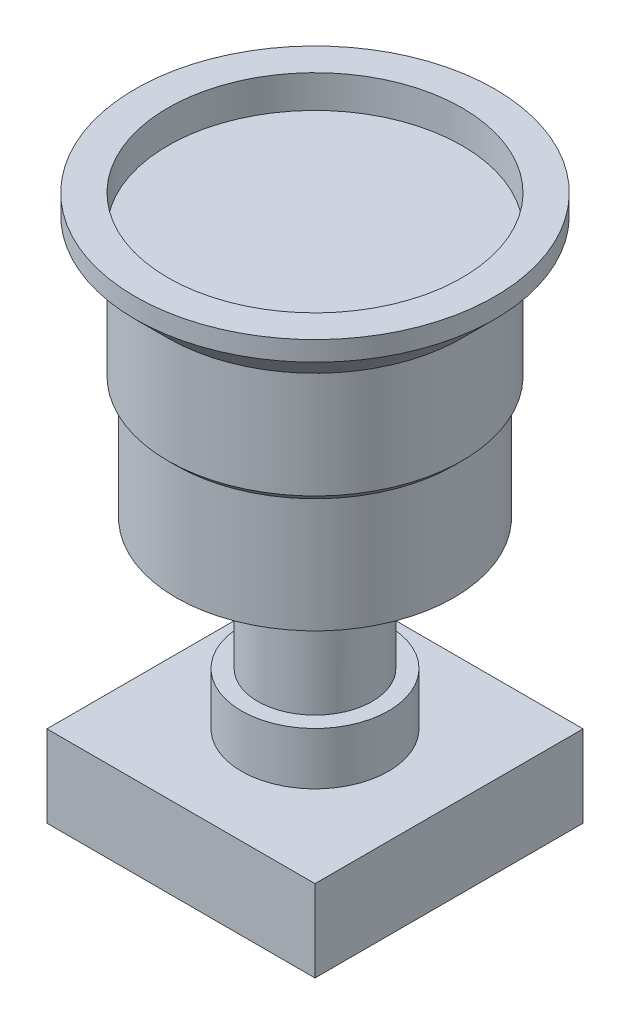
ISO-10303-21;
HEADER;
FILE_DESCRIPTION(('STEP AP214'),'2;1');
FILE_NAME('part.step','',(''),(''),'','','');
FILE_SCHEMA(('AUTOMOTIVE_DESIGN { 1 0 10303 214 1 1 1 1 }'));
ENDSEC;
DATA;
#1=APPLICATION_CONTEXT('core data for automotive mechanical design processes');
#2=APPLICATION_PROTOCOL_DEFINITION('international standard','automotive_design',2000,#1);
#3=PRODUCT_CONTEXT('',#1,'mechanical');
#4=PRODUCT('Part','Part','',(#3));
#5=PRODUCT_RELATED_PRODUCT_CATEGORY('part','',(#4));
#6=PRODUCT_DEFINITION_FORMATION('','',#4);
#7=PRODUCT_DEFINITION_CONTEXT('part definition',#1,'design');
#8=PRODUCT_DEFINITION('design','',#6,#7);
#9=PRODUCT_DEFINITION_SHAPE('','',#8);
#10=(LENGTH_UNIT() NAMED_UNIT(*) SI_UNIT(.MILLI.,.METRE.));
#11=(NAMED_UNIT(*) PLANE_ANGLE_UNIT() SI_UNIT($,.RADIAN.));
#12=(NAMED_UNIT(*) SI_UNIT($,.STERADIAN.) SOLID_ANGLE_UNIT());
#13=UNCERTAINTY_MEASURE_WITH_UNIT(LENGTH_MEASURE(1.E-05),#10,'distance_accuracy_value','');
#14=(GEOMETRIC_REPRESENTATION_CONTEXT(3) GLOBAL_UNCERTAINTY_ASSIGNED_CONTEXT((#13)) GLOBAL_UNIT_ASSIGNED_CONTEXT((#10,
#11,#12)) REPRESENTATION_CONTEXT('',''));
#15=CARTESIAN_POINT('',(0.,0.,0.));
#16=DIRECTION('',(0.,0.,1.));
#17=DIRECTION('',(1.,0.,0.));
#18=AXIS2_PLACEMENT_3D('',#15,#16,#17);
#19=CARTESIAN_POINT('',(0.,50.,0.));
#20=DIRECTION('',(1.,0.,0.));
#21=DIRECTION('',(0.,0.,-1.));
#22=AXIS2_PLACEMENT_3D('',#19,#20,#21);
#23=PLANE('',#22);
#24=DIRECTION('',(0.,0.,1.));
#25=VECTOR('',#24,1.);
#26=CARTESIAN_POINT('',(0.,0.,0.));
#27=LINE('',#26,#25);
#28=CARTESIAN_POINT('',(0.,0.,-164.));
#29=VERTEX_POINT('',#28);
#30=CARTESIAN_POINT('',(0.,0.,0.));
#31=VERTEX_POINT('',#30);
#32=EDGE_CURVE('E109',#29,#31,#27,.T.);
#33=ORIENTED_EDGE('',*,*,#32,.T.);
#34=DIRECTION('',(0.,-1.,0.));
#35=VECTOR('',#34,1.);
#36=CARTESIAN_POINT('',(0.,50.,0.));
#37=LINE('',#36,#35);
#38=CARTESIAN_POINT('',(0.,50.,0.));
#39=VERTEX_POINT('',#38);
#40=EDGE_CURVE('E100',#39,#31,#37,.T.);
#41=ORIENTED_EDGE('',*,*,#40,.F.);
#42=DIRECTION('',(0.,0.,1.));
#43=VECTOR('',#42,1.);
#44=CARTESIAN_POINT('',(0.,50.,0.));
#45=LINE('',#44,#43);
#46=CARTESIAN_POINT('',(0.,50.,-164.));
#47=VERTEX_POINT('',#46);
#48=EDGE_CURVE('E94',#47,#39,#45,.T.);
#49=ORIENTED_EDGE('',*,*,#48,.F.);
#50=DIRECTION('',(0.,-1.,0.));
#51=VECTOR('',#50,1.);
#52=CARTESIAN_POINT('',(0.,50.,-164.));
#53=LINE('',#52,#51);
#54=EDGE_CURVE('E105',#47,#29,#53,.T.);
#55=ORIENTED_EDGE('',*,*,#54,.T.);
#56=EDGE_LOOP('',(#33,#41,#49,#55));
#57=FACE_BOUND('',#56,.T.);
#58=ADVANCED_FACE('F40',(#57),#23,.F.);
#59=CARTESIAN_POINT('',(0.,50.,0.));
#60=DIRECTION('',(0.,0.,-1.));
#61=DIRECTION('',(-1.,0.,0.));
#62=AXIS2_PLACEMENT_3D('',#59,#60,#61);
#63=PLANE('',#62);
#64=DIRECTION('',(1.,0.,0.));
#65=VECTOR('',#64,1.);
#66=CARTESIAN_POINT('',(0.,0.,0.));
#67=LINE('',#66,#65);
#68=CARTESIAN_POINT('',(164.,0.,0.));
#69=VERTEX_POINT('',#68);
#70=EDGE_CURVE('E99',#31,#69,#67,.T.);
#71=ORIENTED_EDGE('',*,*,#70,.T.);
#72=DIRECTION('',(0.,-1.,0.));
#73=VECTOR('',#72,1.);
#74=CARTESIAN_POINT('',(164.,50.,0.));
#75=LINE('',#74,#73);
#76=CARTESIAN_POINT('',(164.,50.,0.));
#77=VERTEX_POINT('',#76);
#78=EDGE_CURVE('E97',#77,#69,#75,.T.);
#79=ORIENTED_EDGE('',*,*,#78,.F.);
#80=DIRECTION('',(1.,0.,0.));
#81=VECTOR('',#80,1.);
#82=CARTESIAN_POINT('',(0.,50.,0.));
#83=LINE('',#82,#81);
#84=EDGE_CURVE('E89',#39,#77,#83,.T.);
#85=ORIENTED_EDGE('',*,*,#84,.F.);
#86=ORIENTED_EDGE('',*,*,#40,.T.);
#87=EDGE_LOOP('',(#71,#79,#85,#86));
#88=FACE_BOUND('',#87,.T.);
#89=ADVANCED_FACE('F98',(#88),#63,.F.);
#90=CARTESIAN_POINT('',(164.,50.,0.));
#91=DIRECTION('',(-1.,0.,0.));
#92=DIRECTION('',(0.,0.,1.));
#93=AXIS2_PLACEMENT_3D('',#90,#91,#92);
#94=PLANE('',#93);
#95=DIRECTION('',(0.,0.,-1.));
#96=VECTOR('',#95,1.);
#97=CARTESIAN_POINT('',(164.,0.,0.));
#98=LINE('',#97,#96);
#99=CARTESIAN_POINT('',(164.,0.,-164.));
#100=VERTEX_POINT('',#99);
#101=EDGE_CURVE('E75',#69,#100,#98,.T.);
#102=ORIENTED_EDGE('',*,*,#101,.T.);
#103=DIRECTION('',(0.,-1.,0.));
#104=VECTOR('',#103,1.);
#105=CARTESIAN_POINT('',(164.,50.,-164.));
#106=LINE('',#105,#104);
#107=CARTESIAN_POINT('',(164.,50.,-164.));
#108=VERTEX_POINT('',#107);
#109=EDGE_CURVE('E101',#108,#100,#106,.T.);
#110=ORIENTED_EDGE('',*,*,#109,.F.);
#111=DIRECTION('',(0.,0.,-1.));
#112=VECTOR('',#111,1.);
#113=CARTESIAN_POINT('',(164.,50.,0.));
#114=LINE('',#113,#112);
#115=EDGE_CURVE('E92',#77,#108,#114,.T.);
#116=ORIENTED_EDGE('',*,*,#115,.F.);
#117=ORIENTED_EDGE('',*,*,#78,.T.);
#118=EDGE_LOOP('',(#102,#110,#116,#117));
#119=FACE_BOUND('',#118,.T.);
#120=ADVANCED_FACE('F103',(#119),#94,.F.);
#121=CARTESIAN_POINT('',(0.,50.,-164.));
#122=DIRECTION('',(0.,0.,1.));
#123=DIRECTION('',(1.,0.,0.));
#124=AXIS2_PLACEMENT_3D('',#121,#122,#123);
#125=PLANE('',#124);
#126=DIRECTION('',(-1.,0.,0.));
#127=VECTOR('',#126,1.);
#128=CARTESIAN_POINT('',(0.,0.,-164.));
#129=LINE('',#128,#127);
#130=EDGE_CURVE('E81',#100,#29,#129,.T.);
#131=ORIENTED_EDGE('',*,*,#130,.T.);
#132=ORIENTED_EDGE('',*,*,#54,.F.);
#133=DIRECTION('',(-1.,0.,0.));
#134=VECTOR('',#133,1.);
#135=CARTESIAN_POINT('',(0.,50.,-164.));
#136=LINE('',#135,#134);
#137=EDGE_CURVE('E58',#108,#47,#136,.T.);
#138=ORIENTED_EDGE('',*,*,#137,.F.);
#139=ORIENTED_EDGE('',*,*,#109,.T.);
#140=EDGE_LOOP('',(#131,#132,#138,#139));
#141=FACE_BOUND('',#140,.T.);
#142=ADVANCED_FACE('F215',(#141),#125,.F.);
#143=CARTESIAN_POINT('',(0.,50.,0.));
#144=DIRECTION('',(0.,-1.,0.));
#145=DIRECTION('',(0.,0.,-1.));
#146=AXIS2_PLACEMENT_3D('',#143,#144,#145);
#147=PLANE('',#146);
#148=CARTESIAN_POINT('',(82.,50.,-82.));
#149=DIRECTION('',(0.,1.,0.));
#150=DIRECTION('',(0.,0.,1.));
#151=AXIS2_PLACEMENT_3D('',#148,#149,#150);
#152=CIRCLE('',#151,45.);
#153=CARTESIAN_POINT('',(82.,50.,-37.));
#154=VERTEX_POINT('',#153);
#155=EDGE_CURVE('E119',#154,#154,#152,.T.);
#156=ORIENTED_EDGE('',*,*,#155,.F.);
#157=EDGE_LOOP('',(#156));
#158=FACE_BOUND('',#157,.T.);
#159=ORIENTED_EDGE('',*,*,#48,.T.);
#160=ORIENTED_EDGE('',*,*,#84,.T.);
#161=ORIENTED_EDGE('',*,*,#115,.T.);
#162=ORIENTED_EDGE('',*,*,#137,.T.);
#163=EDGE_LOOP('',(#159,#160,#161,#162));
#164=FACE_BOUND('',#163,.T.);
#165=ADVANCED_FACE('F90',(#158,#164),#147,.F.);
#166=CARTESIAN_POINT('',(0.,0.,0.));
#167=DIRECTION('',(0.,-1.,0.));
#168=DIRECTION('',(0.,0.,-1.));
#169=AXIS2_PLACEMENT_3D('',#166,#167,#168);
#170=PLANE('',#169);
#171=ORIENTED_EDGE('',*,*,#32,.F.);
#172=ORIENTED_EDGE('',*,*,#130,.F.);
#173=ORIENTED_EDGE('',*,*,#101,.F.);
#174=ORIENTED_EDGE('',*,*,#70,.F.);
#175=EDGE_LOOP('',(#171,#172,#173,#174));
#176=FACE_BOUND('',#175,.T.);
#177=ADVANCED_FACE('F214',(#176),#170,.T.);
#178=CARTESIAN_POINT('',(82.,82.,-82.));
#179=DIRECTION('',(0.,-1.,0.));
#180=DIRECTION('',(0.,0.,-1.));
#181=AXIS2_PLACEMENT_3D('',#178,#179,#180);
#182=CYLINDRICAL_SURFACE('',#181,45.);
#183=CARTESIAN_POINT('',(82.,82.,-82.));
#184=DIRECTION('',(0.,1.,0.));
#185=DIRECTION('',(0.,0.,1.));
#186=AXIS2_PLACEMENT_3D('',#183,#184,#185);
#187=CIRCLE('',#186,45.);
#188=CARTESIAN_POINT('',(82.,82.,-37.));
#189=VERTEX_POINT('',#188);
#190=EDGE_CURVE('E112',#189,#189,#187,.T.);
#191=ORIENTED_EDGE('',*,*,#190,.F.);
#192=EDGE_LOOP('',(#191));
#193=FACE_BOUND('',#192,.T.);
#194=ORIENTED_EDGE('',*,*,#155,.T.);
#195=EDGE_LOOP('',(#194));
#196=FACE_BOUND('',#195,.T.);
#197=ADVANCED_FACE('F211',(#193,#196),#182,.T.);
#198=CARTESIAN_POINT('',(82.,82.,-82.));
#199=DIRECTION('',(0.,1.,0.));
#200=DIRECTION('',(0.,0.,1.));
#201=AXIS2_PLACEMENT_3D('',#198,#199,#200);
#202=PLANE('',#201);
#203=CARTESIAN_POINT('',(82.,82.,-82.));
#204=DIRECTION('',(0.,1.,0.));
#205=DIRECTION('',(0.,0.,1.));
#206=AXIS2_PLACEMENT_3D('',#203,#204,#205);
#207=CIRCLE('',#206,35.);
#208=CARTESIAN_POINT('',(82.,82.,-117.));
#209=VERTEX_POINT('',#208);
#210=EDGE_CURVE('E124',#209,#209,#207,.T.);
#211=ORIENTED_EDGE('',*,*,#210,.F.);
#212=EDGE_LOOP('',(#211));
#213=FACE_BOUND('',#212,.T.);
#214=ORIENTED_EDGE('',*,*,#190,.T.);
#215=EDGE_LOOP('',(#214));
#216=FACE_BOUND('',#215,.T.);
#217=ADVANCED_FACE('F257',(#213,#216),#202,.T.);
#218=CARTESIAN_POINT('',(82.,127.,-82.));
#219=DIRECTION('',(0.,-1.,0.));
#220=DIRECTION('',(0.,0.,-1.));
#221=AXIS2_PLACEMENT_3D('',#218,#219,#220);
#222=CYLINDRICAL_SURFACE('',#221,35.);
#223=CARTESIAN_POINT('',(82.,127.669872981078,-82.));
#224=DIRECTION('',(0.,1.,0.));
#225=DIRECTION('',(0.,0.,1.));
#226=AXIS2_PLACEMENT_3D('',#223,#224,#225);
#227=CIRCLE('',#226,35.);
#228=CARTESIAN_POINT('',(82.,127.669872981078,-117.));
#229=VERTEX_POINT('',#228);
#230=EDGE_CURVE('E11',#229,#229,#227,.F.);
#231=CARTESIAN_POINT('',(82.,127.669872981078,-117.));
#232=CARTESIAN_POINT('',(82.,127.194145137525,-117.));
#233=CARTESIAN_POINT('',(82.,126.718417293972,-117.));
#234=CARTESIAN_POINT('',(82.,125.766961606866,-117.));
#235=CARTESIAN_POINT('',(82.,125.291233763313,-117.));
#236=CARTESIAN_POINT('',(82.,124.339778076208,-117.));
#237=CARTESIAN_POINT('',(82.,123.864050232655,-117.));
#238=CARTESIAN_POINT('',(82.,122.912594545549,-117.));
#239=CARTESIAN_POINT('',(82.,122.436866701996,-117.));
#240=CARTESIAN_POINT('',(82.,121.48541101489,-117.));
#241=CARTESIAN_POINT('',(82.,121.009683171337,-117.));
#242=CARTESIAN_POINT('',(82.,120.058227484232,-117.));
#243=CARTESIAN_POINT('',(82.,119.582499640679,-117.));
#244=CARTESIAN_POINT('',(82.,118.631043953573,-117.));
#245=CARTESIAN_POINT('',(82.,118.15531611002,-117.));
#246=CARTESIAN_POINT('',(82.,117.203860422914,-117.));
#247=CARTESIAN_POINT('',(82.,116.728132579361,-117.));
#248=CARTESIAN_POINT('',(82.,115.776676892256,-117.));
#249=CARTESIAN_POINT('',(82.,115.300949048703,-117.));
#250=CARTESIAN_POINT('',(82.,114.349493361597,-117.));
#251=CARTESIAN_POINT('',(82.,113.873765518044,-117.));
#252=CARTESIAN_POINT('',(82.,112.922309830938,-117.));
#253=CARTESIAN_POINT('',(82.,112.446581987385,-117.));
#254=CARTESIAN_POINT('',(82.,111.495126300279,-117.));
#255=CARTESIAN_POINT('',(82.,111.019398456727,-117.));
#256=CARTESIAN_POINT('',(82.,110.067942769621,-117.));
#257=CARTESIAN_POINT('',(82.,109.592214926068,-117.));
#258=CARTESIAN_POINT('',(82.,108.640759238962,-117.));
#259=CARTESIAN_POINT('',(82.,108.165031395409,-117.));
#260=CARTESIAN_POINT('',(82.,107.213575708303,-117.));
#261=CARTESIAN_POINT('',(82.,106.737847864751,-117.));
#262=CARTESIAN_POINT('',(82.,105.786392177645,-117.));
#263=CARTESIAN_POINT('',(82.,105.310664334092,-117.));
#264=CARTESIAN_POINT('',(82.,104.359208646986,-117.));
#265=CARTESIAN_POINT('',(82.,103.883480803433,-117.));
#266=CARTESIAN_POINT('',(82.,102.932025116327,-117.));
#267=CARTESIAN_POINT('',(82.,102.456297272774,-117.));
#268=CARTESIAN_POINT('',(82.,101.504841585669,-117.));
#269=CARTESIAN_POINT('',(82.,101.029113742116,-117.));
#270=CARTESIAN_POINT('',(82.,100.07765805501,-117.));
#271=CARTESIAN_POINT('',(82.,99.6019302114571,-117.));
#272=CARTESIAN_POINT('',(82.,98.6504745243513,-117.));
#273=CARTESIAN_POINT('',(82.,98.1747466807984,-117.));
#274=CARTESIAN_POINT('',(82.,97.2232909936926,-117.));
#275=CARTESIAN_POINT('',(82.,96.7475631501397,-117.));
#276=CARTESIAN_POINT('',(82.,95.7961074630339,-117.));
#277=CARTESIAN_POINT('',(82.,95.320379619481,-117.));
#278=CARTESIAN_POINT('',(82.,94.3689239323753,-117.));
#279=CARTESIAN_POINT('',(82.,93.8931960888224,-117.));
#280=CARTESIAN_POINT('',(82.,92.9417404017166,-117.));
#281=CARTESIAN_POINT('',(82.,92.4660125581637,-117.));
#282=CARTESIAN_POINT('',(82.,91.5145568710579,-117.));
#283=CARTESIAN_POINT('',(82.,91.038829027505,-117.));
#284=CARTESIAN_POINT('',(82.,90.0873733403992,-117.));
#285=CARTESIAN_POINT('',(82.,89.6116454968463,-117.));
#286=CARTESIAN_POINT('',(82.,88.6601898097405,-117.));
#287=CARTESIAN_POINT('',(82.,88.1844619661876,-117.));
#288=CARTESIAN_POINT('',(82.,87.2330062790818,-117.));
#289=CARTESIAN_POINT('',(82.,86.7572784355289,-117.));
#290=CARTESIAN_POINT('',(82.,85.8058227484232,-117.));
#291=CARTESIAN_POINT('',(82.,85.3300949048703,-117.));
#292=CARTESIAN_POINT('',(82.,84.3786392177645,-117.));
#293=CARTESIAN_POINT('',(82.,83.9029113742116,-117.));
#294=CARTESIAN_POINT('',(82.,82.9514556871058,-117.));
#295=CARTESIAN_POINT('',(82.,82.4757278435529,-117.));
#296=CARTESIAN_POINT('',(82.,82.,-117.));
#297=B_SPLINE_CURVE_WITH_KNOTS('',3,(#231,#232,#233,#234,#235,#236,#237,#238,#239,#240,#241,
#242,#243,#244,#245,#246,#247,#248,#249,#250,#251,#252,#253,#254,#255,#256,#257,#258,#259,#260,
#261,#262,#263,#264,#265,#266,#267,#268,#269,#270,#271,#272,#273,#274,#275,#276,#277,#278,#279,
#280,#281,#282,#283,#284,#285,#286,#287,#288,#289,#290,#291,#292,#293,#294,#295,#296),
.UNSPECIFIED.,.F.,.F.,(4,2,2,2,2,2,2,2,2,2,2,2,2,2,2,2,2,2,2,2,2,2,2,2,2,2,2,2,2,2,2,2,4),(0.,
1.42718353065868,2.85436706131735,4.28155059197603,5.70873412263473,7.13591765329341,
8.56310118395209,9.99028471461077,11.4174682452695,12.8446517759281,14.2718353065868,
15.6990188372455,17.1262023679042,18.5533858985629,19.9805694292216,21.4077529598802,
22.8349364905389,24.2621200211976,25.6893035518563,27.116487082515,28.5436706131737,
29.9708541438324,31.398037674491,32.8252212051497,34.2524047358084,35.6795882664671,
37.1067717971258,38.5339553277844,39.9611388584431,41.3883223891018,42.8155059197605,
44.2426894504192,45.6698729810779),.UNSPECIFIED.);
#298=EDGE_CURVE('BSEAM267',#229,#209,#297,.T.);
#299=ORIENTED_EDGE('',*,*,#230,.T.);
#300=ORIENTED_EDGE('',*,*,#210,.T.);
#301=ORIENTED_EDGE('',*,*,#298,.T.);
#302=ORIENTED_EDGE('',*,*,#298,.F.);
#303=EDGE_LOOP('',(#299,#301,#300,#302));
#304=FACE_BOUND('',#303,.T.);
#305=ADVANCED_FACE('F267',(#304),#222,.T.);
#306=CARTESIAN_POINT('',(82.,152.,-82.));
#307=DIRECTION('',(0.,-1.,0.));
#308=DIRECTION('',(0.,0.,-1.));
#309=AXIS2_PLACEMENT_3D('',#306,#307,#308);
#310=CYLINDRICAL_SURFACE('',#309,42.5);
#311=CARTESIAN_POINT('',(82.,132.,-82.));
#312=DIRECTION('',(0.,1.,0.));
#313=DIRECTION('',(0.,0.,1.));
#314=AXIS2_PLACEMENT_3D('',#311,#312,#313);
#315=CIRCLE('',#314,42.5);
#316=CARTESIAN_POINT('',(82.,132.,-39.5));
#317=VERTEX_POINT('',#316);
#318=EDGE_CURVE('E50',#317,#317,#315,.T.);
#319=ORIENTED_EDGE('',*,*,#318,.T.);
#320=EDGE_LOOP('',(#319));
#321=FACE_BOUND('',#320,.T.);
#322=CARTESIAN_POINT('',(82.,154.506103319891,-82.));
#323=DIRECTION('',(0.,1.,0.));
#324=DIRECTION('',(0.,0.,1.));
#325=AXIS2_PLACEMENT_3D('',#322,#323,#324);
#326=CIRCLE('',#325,42.5);
#327=CARTESIAN_POINT('',(82.,154.506103319891,-39.5));
#328=VERTEX_POINT('',#327);
#329=EDGE_CURVE('E130',#328,#328,#326,.F.);
#330=ORIENTED_EDGE('',*,*,#329,.T.);
#331=EDGE_LOOP('',(#330));
#332=FACE_BOUND('',#331,.T.);
#333=ADVANCED_FACE('F135',(#321,#332),#310,.T.);
#334=CARTESIAN_POINT('',(82.,232.,-82.));
#335=DIRECTION('',(0.,-1.,0.));
#336=DIRECTION('',(0.,0.,-1.));
#337=AXIS2_PLACEMENT_3D('',#334,#335,#336);
#338=CYLINDRICAL_SURFACE('',#337,85.);
#339=CARTESIAN_POINT('',(82.,162.,-82.));
#340=DIRECTION('',(0.,1.,0.));
#341=DIRECTION('',(0.,0.,1.));
#342=AXIS2_PLACEMENT_3D('',#339,#340,#341);
#343=CIRCLE('',#342,85.);
#344=CARTESIAN_POINT('',(82.,162.,3.00000000000002));
#345=VERTEX_POINT('',#344);
#346=EDGE_CURVE('E127',#345,#345,#343,.T.);
#347=ORIENTED_EDGE('',*,*,#346,.T.);
#348=EDGE_LOOP('',(#347));
#349=FACE_BOUND('',#348,.T.);
#350=CARTESIAN_POINT('',(82.,232.,-82.));
#351=DIRECTION('',(0.,1.,0.));
#352=DIRECTION('',(0.,0.,1.));
#353=AXIS2_PLACEMENT_3D('',#350,#351,#352);
#354=CIRCLE('',#353,85.);
#355=CARTESIAN_POINT('',(82.,232.,3.00000000000002));
#356=VERTEX_POINT('',#355);
#357=EDGE_CURVE('E184',#356,#356,#354,.T.);
#358=ORIENTED_EDGE('',*,*,#357,.F.);
#359=EDGE_LOOP('',(#358));
#360=FACE_BOUND('',#359,.T.);
#361=ADVANCED_FACE('F191',(#349,#360),#338,.T.);
#362=CARTESIAN_POINT('',(82.,302.,-82.));
#363=DIRECTION('',(0.,-1.,0.));
#364=DIRECTION('',(0.,0.,-1.));
#365=AXIS2_PLACEMENT_3D('',#362,#363,#364);
#366=CYLINDRICAL_SURFACE('',#365,90.);
#367=CARTESIAN_POINT('',(82.,237.,-82.));
#368=DIRECTION('',(0.,1.,0.));
#369=DIRECTION('',(0.,0.,1.));
#370=AXIS2_PLACEMENT_3D('',#367,#368,#369);
#371=CIRCLE('',#370,90.);
#372=CARTESIAN_POINT('',(82.,237.,8.00000000000001));
#373=VERTEX_POINT('',#372);
#374=EDGE_CURVE('E123',#373,#373,#371,.T.);
#375=ORIENTED_EDGE('',*,*,#374,.T.);
#376=EDGE_LOOP('',(#375));
#377=FACE_BOUND('',#376,.T.);
#378=CARTESIAN_POINT('',(82.,302.,-82.));
#379=DIRECTION('',(0.,1.,0.));
#380=DIRECTION('',(0.,0.,1.));
#381=AXIS2_PLACEMENT_3D('',#378,#379,#380);
#382=CIRCLE('',#381,90.);
#383=CARTESIAN_POINT('',(82.,302.,8.00000000000001));
#384=VERTEX_POINT('',#383);
#385=EDGE_CURVE('E195',#384,#384,#382,.T.);
#386=ORIENTED_EDGE('',*,*,#385,.F.);
#387=EDGE_LOOP('',(#386));
#388=FACE_BOUND('',#387,.T.);
#389=ADVANCED_FACE('F187',(#377,#388),#366,.T.);
#390=CARTESIAN_POINT('',(82.,334.,-82.));
#391=DIRECTION('',(0.,-1.,0.));
#392=DIRECTION('',(0.,0.,-1.));
#393=AXIS2_PLACEMENT_3D('',#390,#391,#392);
#394=CYLINDRICAL_SURFACE('',#393,110.);
#395=CARTESIAN_POINT('',(82.,322.,-82.));
#396=DIRECTION('',(0.,1.,0.));
#397=DIRECTION('',(0.,0.,1.));
#398=AXIS2_PLACEMENT_3D('',#395,#396,#397);
#399=CIRCLE('',#398,110.);
#400=CARTESIAN_POINT('',(82.,322.,28.));
#401=VERTEX_POINT('',#400);
#402=EDGE_CURVE('E120',#401,#401,#399,.T.);
#403=ORIENTED_EDGE('',*,*,#402,.T.);
#404=EDGE_LOOP('',(#403));
#405=FACE_BOUND('',#404,.T.);
#406=CARTESIAN_POINT('',(82.,334.,-82.));
#407=DIRECTION('',(0.,1.,0.));
#408=DIRECTION('',(0.,0.,1.));
#409=AXIS2_PLACEMENT_3D('',#406,#407,#408);
#410=CIRCLE('',#409,110.);
#411=CARTESIAN_POINT('',(82.,334.,28.));
#412=VERTEX_POINT('',#411);
#413=EDGE_CURVE('E196',#412,#412,#410,.T.);
#414=ORIENTED_EDGE('',*,*,#413,.F.);
#415=EDGE_LOOP('',(#414));
#416=FACE_BOUND('',#415,.T.);
#417=ADVANCED_FACE('F190',(#405,#416),#394,.T.);
#418=CARTESIAN_POINT('',(82.,334.,-82.));
#419=DIRECTION('',(0.,1.,0.));
#420=DIRECTION('',(0.,0.,1.));
#421=AXIS2_PLACEMENT_3D('',#418,#419,#420);
#422=PLANE('',#421);
#423=CARTESIAN_POINT('',(82.,334.,-82.));
#424=DIRECTION('',(0.,1.,0.));
#425=DIRECTION('',(0.,0.,1.));
#426=AXIS2_PLACEMENT_3D('',#423,#424,#425);
#427=CIRCLE('',#426,90.);
#428=CARTESIAN_POINT('',(82.,334.,8.00000000000001));
#429=VERTEX_POINT('',#428);
#430=EDGE_CURVE('E404',#429,#429,#427,.T.);
#431=ORIENTED_EDGE('',*,*,#430,.F.);
#432=EDGE_LOOP('',(#431));
#433=FACE_BOUND('',#432,.T.);
#434=ORIENTED_EDGE('',*,*,#413,.T.);
#435=EDGE_LOOP('',(#434));
#436=FACE_BOUND('',#435,.T.);
#437=ADVANCED_FACE('F168',(#433,#436),#422,.T.);
#438=CARTESIAN_POINT('',(82.,322.,-82.));
#439=DIRECTION('',(0.,1.,0.));
#440=DIRECTION('',(0.,0.,1.));
#441=AXIS2_PLACEMENT_3D('',#438,#439,#440);
#442=CONICAL_SURFACE('',#441,110.,0.785398163397449);
#443=ORIENTED_EDGE('',*,*,#385,.T.);
#444=EDGE_LOOP('',(#443));
#445=FACE_BOUND('',#444,.T.);
#446=ORIENTED_EDGE('',*,*,#402,.F.);
#447=EDGE_LOOP('',(#446));
#448=FACE_BOUND('',#447,.T.);
#449=ADVANCED_FACE('F162',(#445,#448),#442,.T.);
#450=CARTESIAN_POINT('',(82.,237.,-82.));
#451=DIRECTION('',(0.,1.,0.));
#452=DIRECTION('',(0.,0.,1.));
#453=AXIS2_PLACEMENT_3D('',#450,#451,#452);
#454=CONICAL_SURFACE('',#453,90.,0.785398163397454);
#455=ORIENTED_EDGE('',*,*,#357,.T.);
#456=EDGE_LOOP('',(#455));
#457=FACE_BOUND('',#456,.T.);
#458=ORIENTED_EDGE('',*,*,#374,.F.);
#459=EDGE_LOOP('',(#458));
#460=FACE_BOUND('',#459,.T.);
#461=ADVANCED_FACE('F149',(#457,#460),#454,.T.);
#462=CARTESIAN_POINT('',(82.,162.,-82.));
#463=DIRECTION('',(0.,1.,0.));
#464=DIRECTION('',(0.,0.,1.));
#465=AXIS2_PLACEMENT_3D('',#462,#463,#464);
#466=CONICAL_SURFACE('',#465,85.,1.39626340159547);
#467=ORIENTED_EDGE('',*,*,#329,.F.);
#468=EDGE_LOOP('',(#467));
#469=FACE_BOUND('',#468,.T.);
#470=ORIENTED_EDGE('',*,*,#346,.F.);
#471=EDGE_LOOP('',(#470));
#472=FACE_BOUND('',#471,.T.);
#473=ADVANCED_FACE('F140',(#469,#472),#466,.T.);
#474=CARTESIAN_POINT('',(82.,132.,-82.));
#475=DIRECTION('',(0.,1.,0.));
#476=DIRECTION('',(0.,0.,1.));
#477=AXIS2_PLACEMENT_3D('',#474,#475,#476);
#478=CONICAL_SURFACE('',#477,42.5,1.0471975511966);
#479=ORIENTED_EDGE('',*,*,#230,.F.);
#480=EDGE_LOOP('',(#479));
#481=FACE_BOUND('',#480,.T.);
#482=ORIENTED_EDGE('',*,*,#318,.F.);
#483=EDGE_LOOP('',(#482));
#484=FACE_BOUND('',#483,.T.);
#485=ADVANCED_FACE('F43',(#481,#484),#478,.T.);
#486=CARTESIAN_POINT('',(82.,314.,-82.));
#487=DIRECTION('',(0.,1.,0.));
#488=DIRECTION('',(0.,0.,1.));
#489=AXIS2_PLACEMENT_3D('',#486,#487,#488);
#490=CYLINDRICAL_SURFACE('',#489,90.);
#491=CARTESIAN_POINT('',(82.,314.,-82.));
#492=DIRECTION('',(0.,1.,0.));
#493=DIRECTION('',(0.,0.,1.));
#494=AXIS2_PLACEMENT_3D('',#491,#492,#493);
#495=CIRCLE('',#494,90.);
#496=CARTESIAN_POINT('',(82.,314.,8.00000000000001));
#497=VERTEX_POINT('',#496);
#498=EDGE_CURVE('E200',#497,#497,#495,.T.);
#499=ORIENTED_EDGE('',*,*,#498,.F.);
#500=EDGE_LOOP('',(#499));
#501=FACE_BOUND('',#500,.T.);
#502=ORIENTED_EDGE('',*,*,#430,.T.);
#503=EDGE_LOOP('',(#502));
#504=FACE_BOUND('',#503,.T.);
#505=ADVANCED_FACE('F139',(#501,#504),#490,.F.);
#506=CARTESIAN_POINT('',(82.,314.,-82.));
#507=DIRECTION('',(0.,1.,0.));
#508=DIRECTION('',(0.,0.,1.));
#509=AXIS2_PLACEMENT_3D('',#506,#507,#508);
#510=PLANE('',#509);
#511=ORIENTED_EDGE('',*,*,#498,.T.);
#512=EDGE_LOOP('',(#511));
#513=FACE_BOUND('',#512,.T.);
#514=ADVANCED_FACE('F146',(#513),#510,.T.);
#515=CLOSED_SHELL('',(#58,#89,#120,#142,#165,#177,#197,#217,#305,#333,#361,#389,#417,#437,#449,
#461,#473,#485,#505,#514));
#516=MANIFOLD_SOLID_BREP('B2',#515);
#517=ADVANCED_BREP_SHAPE_REPRESENTATION('',(#18,#516),#14);
#518=SHAPE_DEFINITION_REPRESENTATION(#9,#517);
ENDSEC;
END-ISO-10303-21;
